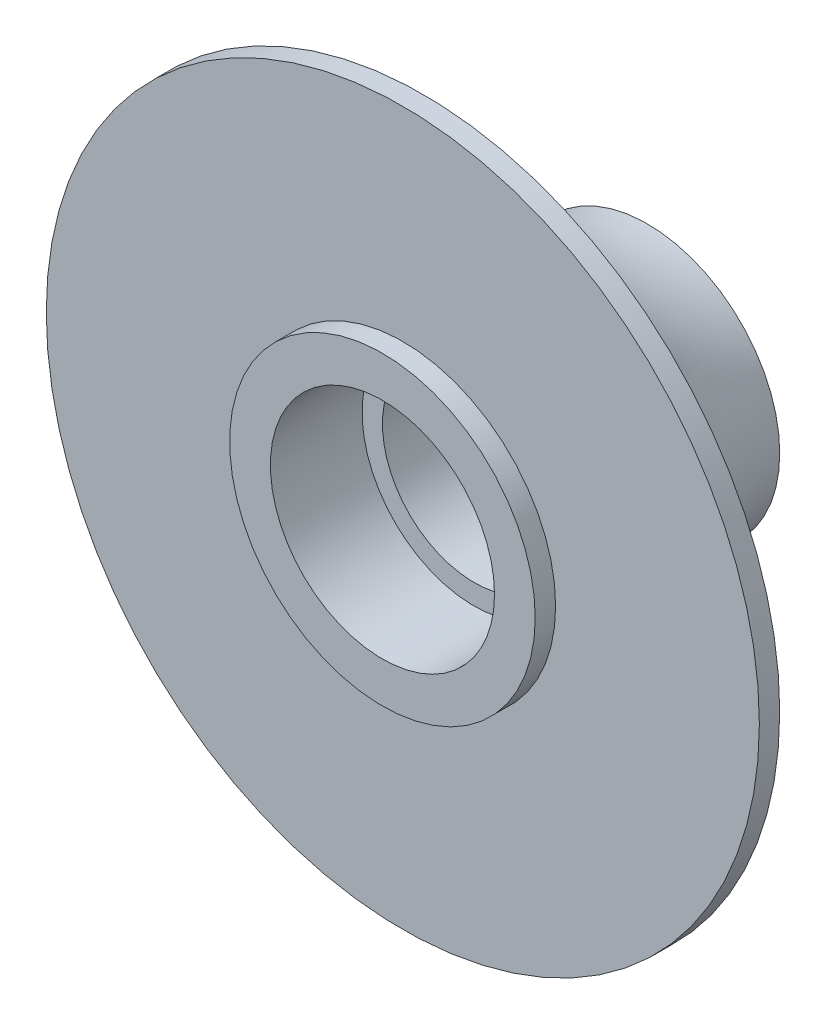
ISO-10303-21;
HEADER;
FILE_DESCRIPTION(('STEP AP214'),'2;1');
FILE_NAME('part.step','',(''),(''),'','','');
FILE_SCHEMA(('AUTOMOTIVE_DESIGN { 1 0 10303 214 1 1 1 1 }'));
ENDSEC;
DATA;
#1=APPLICATION_CONTEXT('core data for automotive mechanical design processes');
#2=APPLICATION_PROTOCOL_DEFINITION('international standard','automotive_design',2000,#1);
#3=PRODUCT_CONTEXT('',#1,'mechanical');
#4=PRODUCT('Part','Part','',(#3));
#5=PRODUCT_RELATED_PRODUCT_CATEGORY('part','',(#4));
#6=PRODUCT_DEFINITION_FORMATION('','',#4);
#7=PRODUCT_DEFINITION_CONTEXT('part definition',#1,'design');
#8=PRODUCT_DEFINITION('design','',#6,#7);
#9=PRODUCT_DEFINITION_SHAPE('','',#8);
#10=(LENGTH_UNIT() NAMED_UNIT(*) SI_UNIT(.MILLI.,.METRE.));
#11=(NAMED_UNIT(*) PLANE_ANGLE_UNIT() SI_UNIT($,.RADIAN.));
#12=(NAMED_UNIT(*) SI_UNIT($,.STERADIAN.) SOLID_ANGLE_UNIT());
#13=UNCERTAINTY_MEASURE_WITH_UNIT(LENGTH_MEASURE(1.E-05),#10,'distance_accuracy_value','');
#14=(GEOMETRIC_REPRESENTATION_CONTEXT(3) GLOBAL_UNCERTAINTY_ASSIGNED_CONTEXT((#13)) GLOBAL_UNIT_ASSIGNED_CONTEXT((#10,
#11,#12)) REPRESENTATION_CONTEXT('',''));
#15=CARTESIAN_POINT('',(0.,0.,0.));
#16=DIRECTION('',(0.,0.,1.));
#17=DIRECTION('',(1.,0.,0.));
#18=AXIS2_PLACEMENT_3D('',#15,#16,#17);
#19=CARTESIAN_POINT('',(12.5,0.,-1.5));
#20=DIRECTION('',(0.,0.,1.));
#21=DIRECTION('',(1.,0.,0.));
#22=AXIS2_PLACEMENT_3D('',#19,#20,#21);
#23=PLANE('',#22);
#24=CARTESIAN_POINT('',(0.,0.,-1.5));
#25=DIRECTION('',(0.,0.,1.));
#26=DIRECTION('',(1.,0.,0.));
#27=AXIS2_PLACEMENT_3D('',#24,#25,#26);
#28=CIRCLE('',#27,17.5);
#29=CARTESIAN_POINT('',(17.5,0.,-1.5));
#30=VERTEX_POINT('',#29);
#31=EDGE_CURVE('E10',#30,#30,#28,.T.);
#32=ORIENTED_EDGE('',*,*,#31,.T.);
#33=EDGE_LOOP('',(#32));
#34=FACE_BOUND('',#33,.T.);
#35=CARTESIAN_POINT('',(0.,0.,-1.5));
#36=DIRECTION('',(0.,0.,1.));
#37=DIRECTION('',(1.,0.,0.));
#38=AXIS2_PLACEMENT_3D('',#35,#36,#37);
#39=CIRCLE('',#38,7.5);
#40=CARTESIAN_POINT('',(7.5,0.,-1.5));
#41=VERTEX_POINT('',#40);
#42=EDGE_CURVE('E21',#41,#41,#39,.T.);
#43=ORIENTED_EDGE('',*,*,#42,.F.);
#44=EDGE_LOOP('',(#43));
#45=FACE_BOUND('',#44,.T.);
#46=ADVANCED_FACE('F15',(#34,#45),#23,.T.);
#47=CARTESIAN_POINT('',(0.,0.,-4.69163056090474));
#48=DIRECTION('',(0.,0.,1.));
#49=DIRECTION('',(1.,0.,0.));
#50=AXIS2_PLACEMENT_3D('',#47,#48,#49);
#51=CYLINDRICAL_SURFACE('',#50,7.5);
#52=ORIENTED_EDGE('',*,*,#42,.T.);
#53=EDGE_LOOP('',(#52));
#54=FACE_BOUND('',#53,.T.);
#55=CARTESIAN_POINT('',(0.,0.,-0.5));
#56=DIRECTION('',(0.,0.,1.));
#57=DIRECTION('',(1.,0.,0.));
#58=AXIS2_PLACEMENT_3D('',#55,#56,#57);
#59=CIRCLE('',#58,7.5);
#60=CARTESIAN_POINT('',(7.5,0.,-0.5));
#61=VERTEX_POINT('',#60);
#62=EDGE_CURVE('E25',#61,#61,#59,.T.);
#63=ORIENTED_EDGE('',*,*,#62,.F.);
#64=EDGE_LOOP('',(#63));
#65=FACE_BOUND('',#64,.T.);
#66=ADVANCED_FACE('F74',(#54,#65),#51,.T.);
#67=CARTESIAN_POINT('',(6.5,0.,-0.5));
#68=DIRECTION('',(0.,0.,1.));
#69=DIRECTION('',(1.,0.,0.));
#70=AXIS2_PLACEMENT_3D('',#67,#68,#69);
#71=PLANE('',#70);
#72=ORIENTED_EDGE('',*,*,#62,.T.);
#73=EDGE_LOOP('',(#72));
#74=FACE_BOUND('',#73,.T.);
#75=CARTESIAN_POINT('',(0.,0.,-0.5));
#76=DIRECTION('',(0.,0.,1.));
#77=DIRECTION('',(1.,0.,0.));
#78=AXIS2_PLACEMENT_3D('',#75,#76,#77);
#79=CIRCLE('',#78,5.5);
#80=CARTESIAN_POINT('',(5.5,0.,-0.5));
#81=VERTEX_POINT('',#80);
#82=EDGE_CURVE('E29',#81,#81,#79,.T.);
#83=ORIENTED_EDGE('',*,*,#82,.F.);
#84=EDGE_LOOP('',(#83));
#85=FACE_BOUND('',#84,.T.);
#86=ADVANCED_FACE('F79',(#74,#85),#71,.T.);
#87=CARTESIAN_POINT('',(0.,0.,-4.69163056090474));
#88=DIRECTION('',(0.,0.,1.));
#89=DIRECTION('',(1.,0.,0.));
#90=AXIS2_PLACEMENT_3D('',#87,#88,#89);
#91=CYLINDRICAL_SURFACE('',#90,5.5);
#92=CARTESIAN_POINT('',(0.,0.,-5.));
#93=DIRECTION('',(0.,0.,1.));
#94=DIRECTION('',(1.,0.,0.));
#95=AXIS2_PLACEMENT_3D('',#92,#93,#94);
#96=CIRCLE('',#95,5.5);
#97=CARTESIAN_POINT('',(5.5,0.,-5.));
#98=VERTEX_POINT('',#97);
#99=EDGE_CURVE('E34',#98,#98,#96,.T.);
#100=ORIENTED_EDGE('',*,*,#99,.F.);
#101=EDGE_LOOP('',(#100));
#102=FACE_BOUND('',#101,.T.);
#103=ORIENTED_EDGE('',*,*,#82,.T.);
#104=EDGE_LOOP('',(#103));
#105=FACE_BOUND('',#104,.T.);
#106=ADVANCED_FACE('F84',(#102,#105),#91,.F.);
#107=CARTESIAN_POINT('',(5.,0.,-5.));
#108=DIRECTION('',(0.,0.,-1.));
#109=DIRECTION('',(-1.,0.,0.));
#110=AXIS2_PLACEMENT_3D('',#107,#108,#109);
#111=PLANE('',#110);
#112=CARTESIAN_POINT('',(0.,0.,-5.));
#113=DIRECTION('',(0.,0.,1.));
#114=DIRECTION('',(1.,0.,0.));
#115=AXIS2_PLACEMENT_3D('',#112,#113,#114);
#116=CIRCLE('',#115,4.5);
#117=CARTESIAN_POINT('',(4.5,0.,-5.));
#118=VERTEX_POINT('',#117);
#119=EDGE_CURVE('E37',#118,#118,#116,.T.);
#120=ORIENTED_EDGE('',*,*,#119,.F.);
#121=EDGE_LOOP('',(#120));
#122=FACE_BOUND('',#121,.T.);
#123=ORIENTED_EDGE('',*,*,#99,.T.);
#124=EDGE_LOOP('',(#123));
#125=FACE_BOUND('',#124,.T.);
#126=ADVANCED_FACE('F91',(#122,#125),#111,.F.);
#127=CARTESIAN_POINT('',(0.,0.,-4.69163056090474));
#128=DIRECTION('',(0.,0.,1.));
#129=DIRECTION('',(1.,0.,0.));
#130=AXIS2_PLACEMENT_3D('',#127,#128,#129);
#131=CYLINDRICAL_SURFACE('',#130,4.5);
#132=CARTESIAN_POINT('',(0.,0.,-11.6547063216567));
#133=DIRECTION('',(0.,0.,1.));
#134=DIRECTION('',(1.,0.,0.));
#135=AXIS2_PLACEMENT_3D('',#132,#133,#134);
#136=CIRCLE('',#135,4.5);
#137=CARTESIAN_POINT('',(4.5,0.,-11.6547063216567));
#138=VERTEX_POINT('',#137);
#139=EDGE_CURVE('E40',#138,#138,#136,.T.);
#140=ORIENTED_EDGE('',*,*,#139,.F.);
#141=EDGE_LOOP('',(#140));
#142=FACE_BOUND('',#141,.T.);
#143=ORIENTED_EDGE('',*,*,#119,.T.);
#144=EDGE_LOOP('',(#143));
#145=FACE_BOUND('',#144,.T.);
#146=ADVANCED_FACE('F95',(#142,#145),#131,.F.);
#147=CARTESIAN_POINT('',(5.,0.,-11.6547063216567));
#148=DIRECTION('',(0.,0.,1.));
#149=DIRECTION('',(1.,0.,0.));
#150=AXIS2_PLACEMENT_3D('',#147,#148,#149);
#151=PLANE('',#150);
#152=CARTESIAN_POINT('',(0.,0.,-11.6547063216567));
#153=DIRECTION('',(0.,0.,1.));
#154=DIRECTION('',(1.,0.,0.));
#155=AXIS2_PLACEMENT_3D('',#152,#153,#154);
#156=CIRCLE('',#155,5.5);
#157=CARTESIAN_POINT('',(5.5,0.,-11.6547063216567));
#158=VERTEX_POINT('',#157);
#159=EDGE_CURVE('E43',#158,#158,#156,.T.);
#160=ORIENTED_EDGE('',*,*,#159,.F.);
#161=EDGE_LOOP('',(#160));
#162=FACE_BOUND('',#161,.T.);
#163=ORIENTED_EDGE('',*,*,#139,.T.);
#164=EDGE_LOOP('',(#163));
#165=FACE_BOUND('',#164,.T.);
#166=ADVANCED_FACE('F99',(#162,#165),#151,.F.);
#167=CARTESIAN_POINT('',(0.,0.,-4.69163056090474));
#168=DIRECTION('',(0.,0.,1.));
#169=DIRECTION('',(1.,0.,0.));
#170=AXIS2_PLACEMENT_3D('',#167,#168,#169);
#171=CYLINDRICAL_SURFACE('',#170,5.5);
#172=CARTESIAN_POINT('',(0.,0.,-13.5));
#173=DIRECTION('',(0.,0.,1.));
#174=DIRECTION('',(1.,0.,0.));
#175=AXIS2_PLACEMENT_3D('',#172,#173,#174);
#176=CIRCLE('',#175,5.5);
#177=CARTESIAN_POINT('',(5.5,0.,-13.5));
#178=VERTEX_POINT('',#177);
#179=EDGE_CURVE('E46',#178,#178,#176,.T.);
#180=ORIENTED_EDGE('',*,*,#179,.F.);
#181=EDGE_LOOP('',(#180));
#182=FACE_BOUND('',#181,.T.);
#183=ORIENTED_EDGE('',*,*,#159,.T.);
#184=EDGE_LOOP('',(#183));
#185=FACE_BOUND('',#184,.T.);
#186=ADVANCED_FACE('F70',(#182,#185),#171,.F.);
#187=CARTESIAN_POINT('',(6.,0.,-13.5));
#188=DIRECTION('',(0.,0.,1.));
#189=DIRECTION('',(1.,0.,0.));
#190=AXIS2_PLACEMENT_3D('',#187,#188,#189);
#191=PLANE('',#190);
#192=CARTESIAN_POINT('',(0.,0.,-13.5));
#193=DIRECTION('',(0.,0.,1.));
#194=DIRECTION('',(1.,0.,0.));
#195=AXIS2_PLACEMENT_3D('',#192,#193,#194);
#196=CIRCLE('',#195,6.5);
#197=CARTESIAN_POINT('',(6.5,0.,-13.5));
#198=VERTEX_POINT('',#197);
#199=EDGE_CURVE('E49',#198,#198,#196,.T.);
#200=ORIENTED_EDGE('',*,*,#199,.F.);
#201=EDGE_LOOP('',(#200));
#202=FACE_BOUND('',#201,.T.);
#203=ORIENTED_EDGE('',*,*,#179,.T.);
#204=EDGE_LOOP('',(#203));
#205=FACE_BOUND('',#204,.T.);
#206=ADVANCED_FACE('F61',(#202,#205),#191,.F.);
#207=CARTESIAN_POINT('',(0.,0.,-13.5));
#208=DIRECTION('',(0.,0.,1.));
#209=DIRECTION('',(1.,0.,0.));
#210=AXIS2_PLACEMENT_3D('',#207,#208,#209);
#211=TOROIDAL_SURFACE('',#210,17.5,11.);
#212=ORIENTED_EDGE('',*,*,#199,.T.);
#213=EDGE_LOOP('',(#212));
#214=FACE_BOUND('',#213,.T.);
#215=CARTESIAN_POINT('',(0.,0.,-2.5));
#216=DIRECTION('',(0.,0.,1.));
#217=DIRECTION('',(1.,0.,0.));
#218=AXIS2_PLACEMENT_3D('',#215,#216,#217);
#219=CIRCLE('',#218,17.5);
#220=CARTESIAN_POINT('',(17.5,0.,-2.5));
#221=VERTEX_POINT('',#220);
#222=EDGE_CURVE('E52',#221,#221,#219,.T.);
#223=ORIENTED_EDGE('',*,*,#222,.F.);
#224=EDGE_LOOP('',(#223));
#225=FACE_BOUND('',#224,.T.);
#226=ADVANCED_FACE('F59',(#214,#225),#211,.F.);
#227=CARTESIAN_POINT('',(0.,0.,-4.69163056090474));
#228=DIRECTION('',(0.,0.,1.));
#229=DIRECTION('',(1.,0.,0.));
#230=AXIS2_PLACEMENT_3D('',#227,#228,#229);
#231=CYLINDRICAL_SURFACE('',#230,17.5);
#232=ORIENTED_EDGE('',*,*,#222,.T.);
#233=EDGE_LOOP('',(#232));
#234=FACE_BOUND('',#233,.T.);
#235=ORIENTED_EDGE('',*,*,#31,.F.);
#236=EDGE_LOOP('',(#235));
#237=FACE_BOUND('',#236,.T.);
#238=ADVANCED_FACE('F56',(#234,#237),#231,.T.);
#239=CLOSED_SHELL('',(#46,#66,#86,#106,#126,#146,#166,#186,#206,#226,#238));
#240=MANIFOLD_SOLID_BREP('B1',#239);
#241=ADVANCED_BREP_SHAPE_REPRESENTATION('',(#18,#240),#14);
#242=SHAPE_DEFINITION_REPRESENTATION(#9,#241);
ENDSEC;
END-ISO-10303-21;
